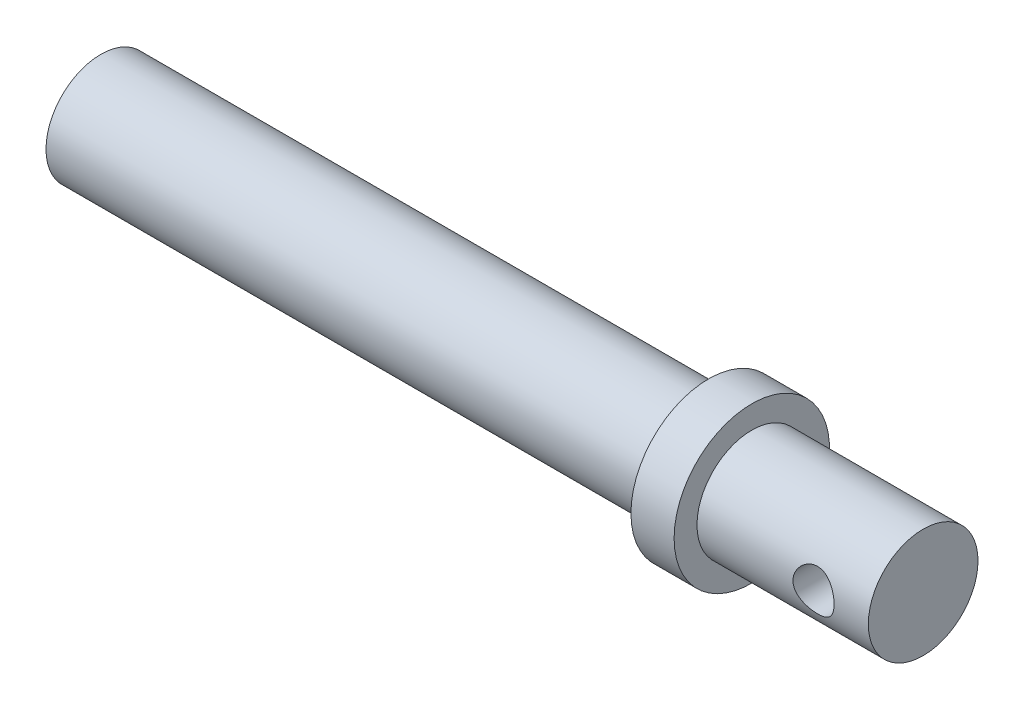
ISO-10303-21;
HEADER;
FILE_DESCRIPTION(('STEP AP214'),'2;1');
FILE_NAME('part.step','',(''),(''),'','','');
FILE_SCHEMA(('AUTOMOTIVE_DESIGN { 1 0 10303 214 1 1 1 1 }'));
ENDSEC;
DATA;
#1=APPLICATION_CONTEXT('core data for automotive mechanical design processes');
#2=APPLICATION_PROTOCOL_DEFINITION('international standard','automotive_design',2000,#1);
#3=PRODUCT_CONTEXT('',#1,'mechanical');
#4=PRODUCT('Part','Part','',(#3));
#5=PRODUCT_RELATED_PRODUCT_CATEGORY('part','',(#4));
#6=PRODUCT_DEFINITION_FORMATION('','',#4);
#7=PRODUCT_DEFINITION_CONTEXT('part definition',#1,'design');
#8=PRODUCT_DEFINITION('design','',#6,#7);
#9=PRODUCT_DEFINITION_SHAPE('','',#8);
#10=(LENGTH_UNIT() NAMED_UNIT(*) SI_UNIT(.MILLI.,.METRE.));
#11=(NAMED_UNIT(*) PLANE_ANGLE_UNIT() SI_UNIT($,.RADIAN.));
#12=(NAMED_UNIT(*) SI_UNIT($,.STERADIAN.) SOLID_ANGLE_UNIT());
#13=UNCERTAINTY_MEASURE_WITH_UNIT(LENGTH_MEASURE(1.E-05),#10,'distance_accuracy_value','');
#14=(GEOMETRIC_REPRESENTATION_CONTEXT(3) GLOBAL_UNCERTAINTY_ASSIGNED_CONTEXT((#13)) GLOBAL_UNIT_ASSIGNED_CONTEXT((#10,
#11,#12)) REPRESENTATION_CONTEXT('',''));
#15=CARTESIAN_POINT('',(0.,0.,0.));
#16=DIRECTION('',(0.,0.,1.));
#17=DIRECTION('',(1.,0.,0.));
#18=AXIS2_PLACEMENT_3D('',#15,#16,#17);
#19=CARTESIAN_POINT('',(95.25,0.,0.));
#20=DIRECTION('',(-1.,0.,0.));
#21=DIRECTION('',(0.,0.,1.));
#22=AXIS2_PLACEMENT_3D('',#19,#20,#21);
#23=CYLINDRICAL_SURFACE('',#22,6.35);
#24=CARTESIAN_POINT('',(70.4,0.,0.));
#25=DIRECTION('',(-1.,0.,0.));
#26=DIRECTION('',(0.,0.,1.));
#27=AXIS2_PLACEMENT_3D('',#24,#25,#26);
#28=CIRCLE('',#27,6.35);
#29=CARTESIAN_POINT('',(70.4,0.,6.35));
#30=VERTEX_POINT('',#29);
#31=EDGE_CURVE('E76',#30,#30,#28,.T.);
#32=ORIENTED_EDGE('',*,*,#31,.T.);
#33=EDGE_LOOP('',(#32));
#34=FACE_BOUND('',#33,.T.);
#35=CARTESIAN_POINT('',(0.,0.,0.));
#36=DIRECTION('',(1.,0.,0.));
#37=DIRECTION('',(0.,0.,-1.));
#38=AXIS2_PLACEMENT_3D('',#35,#36,#37);
#39=CIRCLE('',#38,6.35);
#40=CARTESIAN_POINT('',(0.,0.,-6.35));
#41=VERTEX_POINT('',#40);
#42=EDGE_CURVE('E107',#41,#41,#39,.T.);
#43=ORIENTED_EDGE('',*,*,#42,.T.);
#44=EDGE_LOOP('',(#43));
#45=FACE_BOUND('',#44,.T.);
#46=ADVANCED_FACE('F50',(#34,#45),#23,.T.);
#47=CARTESIAN_POINT('',(0.,0.,0.));
#48=DIRECTION('',(1.,0.,0.));
#49=DIRECTION('',(0.,0.,-1.));
#50=AXIS2_PLACEMENT_3D('',#47,#48,#49);
#51=PLANE('',#50);
#52=CARTESIAN_POINT('',(0.,0.,0.));
#53=DIRECTION('',(-1.,0.,0.));
#54=DIRECTION('',(0.,0.,1.));
#55=AXIS2_PLACEMENT_3D('',#52,#53,#54);
#56=CIRCLE('',#55,2.38125);
#57=CARTESIAN_POINT('',(0.,0.,2.38125));
#58=VERTEX_POINT('',#57);
#59=EDGE_CURVE('E104',#58,#58,#56,.T.);
#60=ORIENTED_EDGE('',*,*,#59,.F.);
#61=EDGE_LOOP('',(#60));
#62=FACE_BOUND('',#61,.T.);
#63=ORIENTED_EDGE('',*,*,#42,.F.);
#64=EDGE_LOOP('',(#63));
#65=FACE_BOUND('',#64,.T.);
#66=ADVANCED_FACE('F91',(#62,#65),#51,.F.);
#67=CARTESIAN_POINT('',(25.4,0.,0.));
#68=DIRECTION('',(-1.,0.,0.));
#69=DIRECTION('',(0.,0.,1.));
#70=AXIS2_PLACEMENT_3D('',#67,#68,#69);
#71=CYLINDRICAL_SURFACE('',#70,2.38125);
#72=CARTESIAN_POINT('',(25.4,0.,0.));
#73=DIRECTION('',(-1.,0.,0.));
#74=DIRECTION('',(0.,0.,1.));
#75=AXIS2_PLACEMENT_3D('',#72,#73,#74);
#76=CIRCLE('',#75,2.38125);
#77=CARTESIAN_POINT('',(25.4,0.,2.38125));
#78=VERTEX_POINT('',#77);
#79=EDGE_CURVE('E109',#78,#78,#76,.T.);
#80=ORIENTED_EDGE('',*,*,#79,.F.);
#81=EDGE_LOOP('',(#80));
#82=FACE_BOUND('',#81,.T.);
#83=ORIENTED_EDGE('',*,*,#59,.T.);
#84=EDGE_LOOP('',(#83));
#85=FACE_BOUND('',#84,.T.);
#86=ADVANCED_FACE('F85',(#82,#85),#71,.F.);
#87=CARTESIAN_POINT('',(25.4,0.,0.));
#88=DIRECTION('',(-1.,0.,0.));
#89=DIRECTION('',(0.,0.,1.));
#90=AXIS2_PLACEMENT_3D('',#87,#88,#89);
#91=PLANE('',#90);
#92=ORIENTED_EDGE('',*,*,#79,.T.);
#93=EDGE_LOOP('',(#92));
#94=FACE_BOUND('',#93,.T.);
#95=ADVANCED_FACE('F98',(#94),#91,.T.);
#96=CARTESIAN_POINT('',(75.4,0.,0.));
#97=DIRECTION('',(-1.,0.,0.));
#98=DIRECTION('',(0.,0.,1.));
#99=AXIS2_PLACEMENT_3D('',#96,#97,#98);
#100=PLANE('',#99);
#101=CARTESIAN_POINT('',(75.4,0.,0.));
#102=DIRECTION('',(-1.,0.,0.));
#103=DIRECTION('',(0.,0.,1.));
#104=AXIS2_PLACEMENT_3D('',#101,#102,#103);
#105=CIRCLE('',#104,9.);
#106=CARTESIAN_POINT('',(75.4,0.,9.));
#107=VERTEX_POINT('',#106);
#108=EDGE_CURVE('E119',#107,#107,#105,.T.);
#109=ORIENTED_EDGE('',*,*,#108,.F.);
#110=EDGE_LOOP('',(#109));
#111=FACE_BOUND('',#110,.T.);
#112=CARTESIAN_POINT('',(75.4,0.,0.));
#113=DIRECTION('',(-1.,0.,0.));
#114=DIRECTION('',(0.,0.,1.));
#115=AXIS2_PLACEMENT_3D('',#112,#113,#114);
#116=CIRCLE('',#115,6.35);
#117=CARTESIAN_POINT('',(75.4,0.,6.35));
#118=VERTEX_POINT('',#117);
#119=EDGE_CURVE('E12',#118,#118,#116,.T.);
#120=ORIENTED_EDGE('',*,*,#119,.T.);
#121=EDGE_LOOP('',(#120));
#122=FACE_BOUND('',#121,.T.);
#123=ADVANCED_FACE('F128',(#111,#122),#100,.F.);
#124=CARTESIAN_POINT('',(70.4,0.,0.));
#125=DIRECTION('',(-1.,0.,0.));
#126=DIRECTION('',(0.,0.,1.));
#127=AXIS2_PLACEMENT_3D('',#124,#125,#126);
#128=PLANE('',#127);
#129=CARTESIAN_POINT('',(70.4,0.,0.));
#130=DIRECTION('',(-1.,0.,0.));
#131=DIRECTION('',(0.,0.,1.));
#132=AXIS2_PLACEMENT_3D('',#129,#130,#131);
#133=CIRCLE('',#132,9.);
#134=CARTESIAN_POINT('',(70.4,0.,9.));
#135=VERTEX_POINT('',#134);
#136=EDGE_CURVE('E116',#135,#135,#133,.T.);
#137=ORIENTED_EDGE('',*,*,#136,.T.);
#138=EDGE_LOOP('',(#137));
#139=FACE_BOUND('',#138,.T.);
#140=ORIENTED_EDGE('',*,*,#31,.F.);
#141=EDGE_LOOP('',(#140));
#142=FACE_BOUND('',#141,.T.);
#143=ADVANCED_FACE('F126',(#139,#142),#128,.T.);
#144=CARTESIAN_POINT('',(75.4,0.,0.));
#145=DIRECTION('',(-1.,0.,0.));
#146=DIRECTION('',(0.,0.,1.));
#147=AXIS2_PLACEMENT_3D('',#144,#145,#146);
#148=CYLINDRICAL_SURFACE('',#147,9.);
#149=ORIENTED_EDGE('',*,*,#108,.T.);
#150=EDGE_LOOP('',(#149));
#151=FACE_BOUND('',#150,.T.);
#152=ORIENTED_EDGE('',*,*,#136,.F.);
#153=EDGE_LOOP('',(#152));
#154=FACE_BOUND('',#153,.T.);
#155=ADVANCED_FACE('F89',(#151,#154),#148,.T.);
#156=CARTESIAN_POINT('',(95.25,0.,0.));
#157=DIRECTION('',(1.,0.,0.));
#158=DIRECTION('',(0.,0.,-1.));
#159=AXIS2_PLACEMENT_3D('',#156,#157,#158);
#160=PLANE('',#159);
#161=CARTESIAN_POINT('',(95.25,0.,0.));
#162=DIRECTION('',(1.,0.,0.));
#163=DIRECTION('',(0.,0.,-1.));
#164=AXIS2_PLACEMENT_3D('',#161,#162,#163);
#165=CIRCLE('',#164,6.35);
#166=CARTESIAN_POINT('',(95.25,0.,-6.35));
#167=VERTEX_POINT('',#166);
#168=EDGE_CURVE('E66',#167,#167,#165,.T.);
#169=ORIENTED_EDGE('',*,*,#168,.T.);
#170=EDGE_LOOP('',(#169));
#171=FACE_BOUND('',#170,.T.);
#172=ADVANCED_FACE('F83',(#171),#160,.T.);
#173=CARTESIAN_POINT('',(88.9,0.,-6.35));
#174=DIRECTION('',(0.,0.,1.));
#175=DIRECTION('',(1.,0.,0.));
#176=AXIS2_PLACEMENT_3D('',#173,#174,#175);
#177=CYLINDRICAL_SURFACE('',#176,2.38125000000001);
#178=CARTESIAN_POINT('',(91.28125,0.,6.35));
#179=CARTESIAN_POINT('',(91.2812546074062,-0.128960656063842,6.3500034521164));
#180=CARTESIAN_POINT('',(91.2707411306057,-0.257889758828597,6.34603727112054));
#181=CARTESIAN_POINT('',(91.229135240009,-0.511894855609376,6.33061179910997));
#182=CARTESIAN_POINT('',(91.198045790503,-0.636971401930343,6.31915358744214));
#183=CARTESIAN_POINT('',(91.1165421096873,-0.879571496173027,6.28997396421577));
#184=CARTESIAN_POINT('',(91.0661651545454,-0.997109105857626,6.27226463904736));
#185=CARTESIAN_POINT('',(90.9477060693374,-1.22205640487941,6.23234668827498));
#186=CARTESIAN_POINT('',(90.8796191904487,-1.32946336719489,6.21013685623732));
#187=CARTESIAN_POINT('',(90.7246526069249,-1.53566243706025,6.16245667066806));
#188=CARTESIAN_POINT('',(90.6371532086632,-1.63396728411503,6.1368940410141));
#189=CARTESIAN_POINT('',(90.4471609349791,-1.81490019090553,6.08584350633231));
#190=CARTESIAN_POINT('',(90.3446634872105,-1.89752345220235,6.06035562651864));
#191=CARTESIAN_POINT('',(90.1228235203069,-2.04784646017877,6.01126672105648));
#192=CARTESIAN_POINT('',(90.0029880681085,-2.11485786698269,5.98777455003049));
#193=CARTESIAN_POINT('',(89.7527282377575,-2.2275585105536,5.94677278126925));
#194=CARTESIAN_POINT('',(89.6223081134913,-2.27325626375968,5.92926079474211));
#195=CARTESIAN_POINT('',(89.3601896748401,-2.3401088424036,5.90318880358315));
#196=CARTESIAN_POINT('',(89.2287632514837,-2.36219354234461,5.89429104906955));
#197=CARTESIAN_POINT('',(88.9637918491848,-2.38410045993992,5.88546672569678));
#198=CARTESIAN_POINT('',(88.8302477679743,-2.38393187174177,5.88553645184146));
#199=CARTESIAN_POINT('',(88.5733408787244,-2.36204807005904,5.89434799715886));
#200=CARTESIAN_POINT('',(88.4498470616549,-2.34162296008043,5.90257056832905));
#201=CARTESIAN_POINT('',(88.2081878987316,-2.28193866490974,5.92589839169503));
#202=CARTESIAN_POINT('',(88.0900233582505,-2.24267664340423,5.94100468036945));
#203=CARTESIAN_POINT('',(87.8597476549814,-2.14572450857898,5.97671052227027));
#204=CARTESIAN_POINT('',(87.7477933157824,-2.08769979870147,5.99740859806213));
#205=CARTESIAN_POINT('',(87.5348361415743,-1.95510267098283,6.04193308596169));
#206=CARTESIAN_POINT('',(87.4338371056875,-1.88052453982124,6.06576057700738));
#207=CARTESIAN_POINT('',(87.2385166839542,-1.71103576966897,6.11581261688842));
#208=CARTESIAN_POINT('',(87.1451002828124,-1.61509549213167,6.14209064085877));
#209=CARTESIAN_POINT('',(86.9754134786483,-1.4086087379252,6.19270618460486));
#210=CARTESIAN_POINT('',(86.8991457108135,-1.29806002055207,6.21704340577199));
#211=CARTESIAN_POINT('',(86.7649229946633,-1.06318595622546,6.26151901759414));
#212=CARTESIAN_POINT('',(86.7072694648116,-0.938674008228491,6.2815866598714));
#213=CARTESIAN_POINT('',(86.6140276157213,-0.680778500207775,6.31473715344052));
#214=CARTESIAN_POINT('',(86.5784294962092,-0.547398909717654,6.3278231066712));
#215=CARTESIAN_POINT('',(86.5320488247772,-0.283170698498504,6.34499053624553));
#216=CARTESIAN_POINT('',(86.5200476123678,-0.152564496055005,6.34951373328277));
#217=CARTESIAN_POINT('',(86.5176529360589,0.108858804467354,6.3504110624895));
#218=CARTESIAN_POINT('',(86.5272546814971,0.239675849361107,6.34678700139145));
#219=CARTESIAN_POINT('',(86.566867192165,0.492541002091957,6.33208839264071));
#220=CARTESIAN_POINT('',(86.5960795756826,0.614732908211652,6.32130547652659));
#221=CARTESIAN_POINT('',(86.6730328901689,0.852395035994594,6.29366719883101));
#222=CARTESIAN_POINT('',(86.7207762309925,0.967864381176715,6.27681104747723));
#223=CARTESIAN_POINT('',(86.8349584297477,1.19260582711238,6.23807528747194));
#224=CARTESIAN_POINT('',(86.9019053951421,1.30159614514801,6.2160626283234));
#225=CARTESIAN_POINT('',(87.0520199887848,1.50716092986602,6.16944841108904));
#226=CARTESIAN_POINT('',(87.1351936054154,1.60373079092934,6.14484589877607));
#227=CARTESIAN_POINT('',(87.3210790438723,1.78757389300696,6.09398910566946));
#228=CARTESIAN_POINT('',(87.4246444651517,1.87398269671166,6.0677218069967));
#229=CARTESIAN_POINT('',(87.6453215732234,2.02836541925647,6.0178761999813));
#230=CARTESIAN_POINT('',(87.7624344750793,2.09633768270548,5.99429813321109));
#231=CARTESIAN_POINT('',(88.0078503790011,2.21198715461409,5.9525984234316));
#232=CARTESIAN_POINT('',(88.1361977841328,2.25957900646983,5.93449982021483));
#233=CARTESIAN_POINT('',(88.3999529998544,2.33216265003687,5.9063577721447));
#234=CARTESIAN_POINT('',(88.5353563874645,2.35716842360037,5.89630934428766));
#235=CARTESIAN_POINT('',(88.8000131532715,2.3826207601782,5.8860673298321));
#236=CARTESIAN_POINT('',(88.9291030528506,2.38454138749642,5.88528230680804));
#237=CARTESIAN_POINT('',(89.1856631895884,2.36754536081029,5.89213980233151));
#238=CARTESIAN_POINT('',(89.3131335791662,2.34863068262071,5.89978152177002));
#239=CARTESIAN_POINT('',(89.5588874724126,2.29164857313009,5.92213924766874));
#240=CARTESIAN_POINT('',(89.6773326246645,2.25418329827483,5.93663223035452));
#241=CARTESIAN_POINT('',(89.9063249947349,2.16169393638123,5.97092957922828));
#242=CARTESIAN_POINT('',(90.0168702073114,2.106665410501,5.99073528792403));
#243=CARTESIAN_POINT('',(90.233225028645,1.97726420551819,6.03471811697544));
#244=CARTESIAN_POINT('',(90.3384826399199,1.90202872074779,6.0590699627503));
#245=CARTESIAN_POINT('',(90.5353497280418,1.73568496096226,6.10879916727019));
#246=CARTESIAN_POINT('',(90.626954849974,1.64457164120333,6.13417684997243));
#247=CARTESIAN_POINT('',(90.7989706048672,1.44316512989559,6.18474799068186));
#248=CARTESIAN_POINT('',(90.8785072085776,1.33210084768812,6.20985716529773));
#249=CARTESIAN_POINT('',(91.0177609652515,1.0973009918313,6.25561541700536));
#250=CARTESIAN_POINT('',(91.0774765755315,0.973564432868858,6.2762641468935));
#251=CARTESIAN_POINT('',(91.1770732161142,0.711198542678667,6.31149189513105));
#252=CARTESIAN_POINT('',(91.2159832150555,0.572156307796804,6.3257693073889));
#253=CARTESIAN_POINT('',(91.2680625738741,0.288727727100132,6.34501909460094));
#254=CARTESIAN_POINT('',(91.2812448429861,0.144344098479214,6.34999613608798));
#255=CARTESIAN_POINT('',(91.28125,0.,6.35));
#256=B_SPLINE_CURVE_WITH_KNOTS('',3,(#178,#179,#180,#181,#182,#183,#184,#185,#186,#187,#188,
#189,#190,#191,#192,#193,#194,#195,#196,#197,#198,#199,#200,#201,#202,#203,#204,#205,#206,#207,
#208,#209,#210,#211,#212,#213,#214,#215,#216,#217,#218,#219,#220,#221,#222,#223,#224,#225,#226,
#227,#228,#229,#230,#231,#232,#233,#234,#235,#236,#237,#238,#239,#240,#241,#242,#243,#244,#245,
#246,#247,#248,#249,#250,#251,#252,#253,#254,#255),.UNSPECIFIED.,.T.,.F.,(4,2,2,2,2,2,2,2,2,2,2,
2,2,2,2,2,2,2,2,2,2,2,2,2,2,2,2,2,2,2,2,2,2,2,2,2,2,2,4),(0.,0.386349559977391,
0.772643472379608,1.15819454862656,1.54384911513007,1.94426869500062,2.34481060319426,
2.76060970771384,3.17624252596513,3.57482575636833,3.97324430901537,4.34781872877956,
4.72244956671187,5.10416823314394,5.48601885306512,5.89353268420603,6.30110909424294,
6.71498808266646,7.12868303271919,7.52038468672033,7.91199948569953,8.28856670204098,
8.66518290541447,9.05286514702116,9.44069073281542,9.85101724635858,10.2613805903573,
10.6734461842944,11.0852565149346,11.470620370249,11.8559476846038,12.2295148860212,
12.6031765756721,12.9964254911628,13.3897995792034,13.8044607332579,14.219154153156,
14.6518076761337,15.0842440535135),.UNSPECIFIED.);
#257=CARTESIAN_POINT('',(91.28125,0.,6.35));
#258=VERTEX_POINT('',#257);
#259=EDGE_CURVE('E61',#258,#258,#256,.T.);
#260=ORIENTED_EDGE('',*,*,#259,.F.);
#261=EDGE_LOOP('',(#260));
#262=FACE_BOUND('',#261,.T.);
#263=CARTESIAN_POINT('',(91.28125,0.,-6.35));
#264=CARTESIAN_POINT('',(91.2812546074062,0.128960656063842,-6.3500034521164));
#265=CARTESIAN_POINT('',(91.2707411306057,0.257889758828597,-6.34603727112054));
#266=CARTESIAN_POINT('',(91.229135240009,0.511894855609376,-6.33061179910997));
#267=CARTESIAN_POINT('',(91.198045790503,0.636971401930343,-6.31915358744214));
#268=CARTESIAN_POINT('',(91.1165421096873,0.879571496173027,-6.28997396421577));
#269=CARTESIAN_POINT('',(91.0661651545454,0.997109105857626,-6.27226463904736));
#270=CARTESIAN_POINT('',(90.9477060693374,1.22205640487941,-6.23234668827498));
#271=CARTESIAN_POINT('',(90.8796191904487,1.32946336719489,-6.21013685623732));
#272=CARTESIAN_POINT('',(90.7246526069249,1.53566243706025,-6.16245667066806));
#273=CARTESIAN_POINT('',(90.6371532086632,1.63396728411503,-6.1368940410141));
#274=CARTESIAN_POINT('',(90.4471609349791,1.81490019090553,-6.08584350633231));
#275=CARTESIAN_POINT('',(90.3446634872105,1.89752345220235,-6.06035562651864));
#276=CARTESIAN_POINT('',(90.1228235203069,2.04784646017877,-6.01126672105648));
#277=CARTESIAN_POINT('',(90.0029880681085,2.11485786698269,-5.98777455003049));
#278=CARTESIAN_POINT('',(89.7527282377575,2.2275585105536,-5.94677278126925));
#279=CARTESIAN_POINT('',(89.6223081134913,2.27325626375968,-5.92926079474211));
#280=CARTESIAN_POINT('',(89.3601896748401,2.3401088424036,-5.90318880358315));
#281=CARTESIAN_POINT('',(89.2287632514837,2.36219354234461,-5.89429104906955));
#282=CARTESIAN_POINT('',(88.9637918491848,2.38410045993992,-5.88546672569678));
#283=CARTESIAN_POINT('',(88.8302477679743,2.38393187174177,-5.88553645184146));
#284=CARTESIAN_POINT('',(88.5733408787244,2.36204807005904,-5.89434799715886));
#285=CARTESIAN_POINT('',(88.4498470616549,2.34162296008043,-5.90257056832905));
#286=CARTESIAN_POINT('',(88.2081878987316,2.28193866490974,-5.92589839169503));
#287=CARTESIAN_POINT('',(88.0900233582505,2.24267664340423,-5.94100468036945));
#288=CARTESIAN_POINT('',(87.8597476549814,2.14572450857898,-5.97671052227026));
#289=CARTESIAN_POINT('',(87.7477933157824,2.08769979870148,-5.99740859806213));
#290=CARTESIAN_POINT('',(87.5348361415743,1.95510267098283,-6.04193308596169));
#291=CARTESIAN_POINT('',(87.4338371056875,1.88052453982124,-6.06576057700738));
#292=CARTESIAN_POINT('',(87.2385166839542,1.71103576966896,-6.11581261688842));
#293=CARTESIAN_POINT('',(87.1451002828124,1.61509549213167,-6.14209064085877));
#294=CARTESIAN_POINT('',(86.9754134786483,1.40860873792519,-6.19270618460486));
#295=CARTESIAN_POINT('',(86.8991457108135,1.29806002055206,-6.21704340577199));
#296=CARTESIAN_POINT('',(86.7649229946633,1.06318595622546,-6.26151901759414));
#297=CARTESIAN_POINT('',(86.7072694648116,0.93867400822849,-6.2815866598714));
#298=CARTESIAN_POINT('',(86.6140276157213,0.680778500207774,-6.31473715344052));
#299=CARTESIAN_POINT('',(86.5784294962092,0.547398909717653,-6.3278231066712));
#300=CARTESIAN_POINT('',(86.5320488247772,0.283170698498503,-6.34499053624553));
#301=CARTESIAN_POINT('',(86.5200476123678,0.152564496055004,-6.34951373328277));
#302=CARTESIAN_POINT('',(86.5176529360589,-0.108858804467353,-6.35041106248949));
#303=CARTESIAN_POINT('',(86.5272546814971,-0.239675849361106,-6.34678700139145));
#304=CARTESIAN_POINT('',(86.566867192165,-0.492541002091952,-6.33208839264071));
#305=CARTESIAN_POINT('',(86.5960795756826,-0.614732908211645,-6.32130547652659));
#306=CARTESIAN_POINT('',(86.6730328901689,-0.852395035994588,-6.29366719883101));
#307=CARTESIAN_POINT('',(86.7207762309925,-0.967864381176712,-6.27681104747723));
#308=CARTESIAN_POINT('',(86.8349584297477,-1.19260582711238,-6.23807528747194));
#309=CARTESIAN_POINT('',(86.9019053951421,-1.30159614514801,-6.2160626283234));
#310=CARTESIAN_POINT('',(87.0520199887848,-1.50716092986602,-6.16944841108904));
#311=CARTESIAN_POINT('',(87.1351936054154,-1.60373079092934,-6.14484589877607));
#312=CARTESIAN_POINT('',(87.3210790438723,-1.78757389300696,-6.09398910566946));
#313=CARTESIAN_POINT('',(87.4246444651517,-1.87398269671166,-6.0677218069967));
#314=CARTESIAN_POINT('',(87.6453215732234,-2.02836541925647,-6.0178761999813));
#315=CARTESIAN_POINT('',(87.7624344750793,-2.09633768270549,-5.99429813321109));
#316=CARTESIAN_POINT('',(88.0078503790011,-2.2119871546141,-5.9525984234316));
#317=CARTESIAN_POINT('',(88.1361977841328,-2.25957900646983,-5.93449982021483));
#318=CARTESIAN_POINT('',(88.3999529998544,-2.33216265003687,-5.9063577721447));
#319=CARTESIAN_POINT('',(88.5353563874645,-2.35716842360038,-5.89630934428766));
#320=CARTESIAN_POINT('',(88.8000131532715,-2.3826207601782,-5.8860673298321));
#321=CARTESIAN_POINT('',(88.9291030528506,-2.38454138749642,-5.88528230680804));
#322=CARTESIAN_POINT('',(89.1856631895884,-2.36754536081029,-5.89213980233151));
#323=CARTESIAN_POINT('',(89.3131335791662,-2.34863068262072,-5.89978152177002));
#324=CARTESIAN_POINT('',(89.5588874724126,-2.29164857313009,-5.92213924766874));
#325=CARTESIAN_POINT('',(89.6773326246645,-2.25418329827482,-5.93663223035452));
#326=CARTESIAN_POINT('',(89.9063249947349,-2.16169393638122,-5.97092957922828));
#327=CARTESIAN_POINT('',(90.0168702073114,-2.106665410501,-5.99073528792403));
#328=CARTESIAN_POINT('',(90.233225028645,-1.97726420551819,-6.03471811697544));
#329=CARTESIAN_POINT('',(90.3384826399199,-1.90202872074779,-6.0590699627503));
#330=CARTESIAN_POINT('',(90.5353497280418,-1.73568496096226,-6.10879916727019));
#331=CARTESIAN_POINT('',(90.626954849974,-1.64457164120333,-6.13417684997243));
#332=CARTESIAN_POINT('',(90.7989706048672,-1.44316512989558,-6.18474799068186));
#333=CARTESIAN_POINT('',(90.8785072085776,-1.33210084768812,-6.20985716529774));
#334=CARTESIAN_POINT('',(91.0177609652516,-1.09730099183129,-6.25561541700536));
#335=CARTESIAN_POINT('',(91.0774765755315,-0.973564432868855,-6.2762641468935));
#336=CARTESIAN_POINT('',(91.1770732161142,-0.711198542678667,-6.31149189513105));
#337=CARTESIAN_POINT('',(91.2159832150555,-0.572156307796805,-6.3257693073889));
#338=CARTESIAN_POINT('',(91.2680625738741,-0.288727727100132,-6.34501909460094));
#339=CARTESIAN_POINT('',(91.2812448429861,-0.144344098479214,-6.34999613608798));
#340=CARTESIAN_POINT('',(91.28125,0.,-6.35));
#341=B_SPLINE_CURVE_WITH_KNOTS('',3,(#263,#264,#265,#266,#267,#268,#269,#270,#271,#272,#273,
#274,#275,#276,#277,#278,#279,#280,#281,#282,#283,#284,#285,#286,#287,#288,#289,#290,#291,#292,
#293,#294,#295,#296,#297,#298,#299,#300,#301,#302,#303,#304,#305,#306,#307,#308,#309,#310,#311,
#312,#313,#314,#315,#316,#317,#318,#319,#320,#321,#322,#323,#324,#325,#326,#327,#328,#329,#330,
#331,#332,#333,#334,#335,#336,#337,#338,#339,#340),.UNSPECIFIED.,.T.,.F.,(4,2,2,2,2,2,2,2,2,2,2,
2,2,2,2,2,2,2,2,2,2,2,2,2,2,2,2,2,2,2,2,2,2,2,2,2,2,2,4),(0.,0.386349559977391,
0.772643472379608,1.15819454862656,1.54384911513007,1.94426869500062,2.34481060319426,
2.76060970771384,3.17624252596513,3.57482575636833,3.97324430901537,4.34781872877956,
4.72244956671187,5.10416823314392,5.48601885306512,5.89353268420605,6.30110909424294,
6.71498808266646,7.12868303271919,7.52038468672033,7.91199948569953,8.28856670204097,
8.66518290541447,9.05286514702116,9.44069073281542,9.85101724635858,10.2613805903573,
10.6734461842944,11.0852565149346,11.470620370249,11.8559476846038,12.2295148860212,
12.6031765756721,12.9964254911628,13.3897995792034,13.8044607332579,14.219154153156,
14.6518076761337,15.0842440535136),.UNSPECIFIED.);
#342=CARTESIAN_POINT('',(91.28125,0.,-6.35));
#343=VERTEX_POINT('',#342);
#344=EDGE_CURVE('E57',#343,#343,#341,.T.);
#345=ORIENTED_EDGE('',*,*,#344,.F.);
#346=EDGE_LOOP('',(#345));
#347=FACE_BOUND('',#346,.T.);
#348=ADVANCED_FACE('F77',(#262,#347),#177,.F.);
#349=ORIENTED_EDGE('',*,*,#344,.T.);
#350=EDGE_LOOP('',(#349));
#351=FACE_BOUND('',#350,.T.);
#352=ORIENTED_EDGE('',*,*,#259,.T.);
#353=EDGE_LOOP('',(#352));
#354=FACE_BOUND('',#353,.T.);
#355=ORIENTED_EDGE('',*,*,#168,.F.);
#356=EDGE_LOOP('',(#355));
#357=FACE_BOUND('',#356,.T.);
#358=ORIENTED_EDGE('',*,*,#119,.F.);
#359=EDGE_LOOP('',(#358));
#360=FACE_BOUND('',#359,.T.);
#361=ADVANCED_FACE('F82',(#351,#354,#357,#360),#23,.T.);
#362=CLOSED_SHELL('',(#46,#66,#86,#95,#123,#143,#155,#172,#348,#361));
#363=MANIFOLD_SOLID_BREP('B2',#362);
#364=ADVANCED_BREP_SHAPE_REPRESENTATION('',(#18,#363),#14);
#365=SHAPE_DEFINITION_REPRESENTATION(#9,#364);
ENDSEC;
END-ISO-10303-21;
